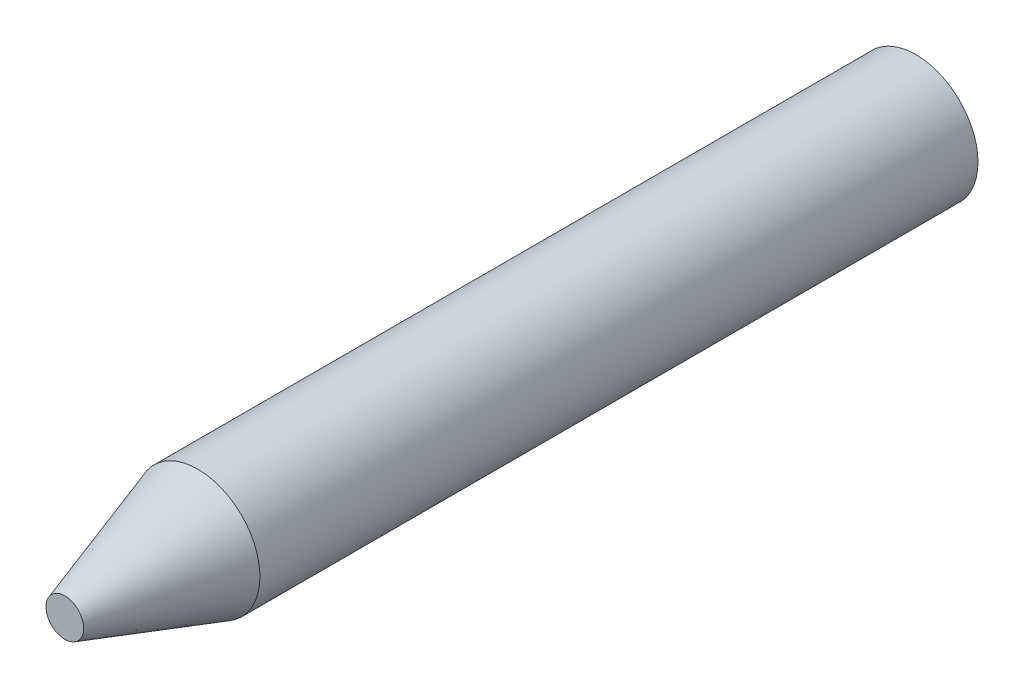
ISO-10303-21;
HEADER;
FILE_DESCRIPTION(('STEP AP214'),'2;1');
FILE_NAME('part.step','',(''),(''),'','','');
FILE_SCHEMA(('AUTOMOTIVE_DESIGN { 1 0 10303 214 1 1 1 1 }'));
ENDSEC;
DATA;
#1=APPLICATION_CONTEXT('core data for automotive mechanical design processes');
#2=APPLICATION_PROTOCOL_DEFINITION('international standard','automotive_design',2000,#1);
#3=PRODUCT_CONTEXT('',#1,'mechanical');
#4=PRODUCT('Part','Part','',(#3));
#5=PRODUCT_RELATED_PRODUCT_CATEGORY('part','',(#4));
#6=PRODUCT_DEFINITION_FORMATION('','',#4);
#7=PRODUCT_DEFINITION_CONTEXT('part definition',#1,'design');
#8=PRODUCT_DEFINITION('design','',#6,#7);
#9=PRODUCT_DEFINITION_SHAPE('','',#8);
#10=(LENGTH_UNIT() NAMED_UNIT(*) SI_UNIT(.MILLI.,.METRE.));
#11=(NAMED_UNIT(*) PLANE_ANGLE_UNIT() SI_UNIT($,.RADIAN.));
#12=(NAMED_UNIT(*) SI_UNIT($,.STERADIAN.) SOLID_ANGLE_UNIT());
#13=UNCERTAINTY_MEASURE_WITH_UNIT(LENGTH_MEASURE(1.E-05),#10,'distance_accuracy_value','');
#14=(GEOMETRIC_REPRESENTATION_CONTEXT(3) GLOBAL_UNCERTAINTY_ASSIGNED_CONTEXT((#13)) GLOBAL_UNIT_ASSIGNED_CONTEXT((#10,
#11,#12)) REPRESENTATION_CONTEXT('',''));
#15=CARTESIAN_POINT('',(0.,0.,0.));
#16=DIRECTION('',(0.,0.,1.));
#17=DIRECTION('',(1.,0.,0.));
#18=AXIS2_PLACEMENT_3D('',#15,#16,#17);
#19=CARTESIAN_POINT('',(0.,0.,96.));
#20=DIRECTION('',(0.,0.,-1.));
#21=DIRECTION('',(-1.,0.,0.));
#22=AXIS2_PLACEMENT_3D('',#19,#20,#21);
#23=CYLINDRICAL_SURFACE('',#22,7.);
#24=CARTESIAN_POINT('',(0.,0.,80.9999999999999));
#25=DIRECTION('',(0.,0.,1.));
#26=DIRECTION('',(1.,0.,0.));
#27=AXIS2_PLACEMENT_3D('',#24,#25,#26);
#28=CIRCLE('',#27,7.);
#29=CARTESIAN_POINT('',(-7.,0.,80.9999999999999));
#30=VERTEX_POINT('',#29);
#31=EDGE_CURVE('E10',#30,#30,#28,.F.);
#32=ORIENTED_EDGE('',*,*,#31,.T.);
#33=EDGE_LOOP('',(#32));
#34=FACE_BOUND('',#33,.T.);
#35=CARTESIAN_POINT('',(0.,0.,0.));
#36=DIRECTION('',(0.,0.,1.));
#37=DIRECTION('',(1.,0.,0.));
#38=AXIS2_PLACEMENT_3D('',#35,#36,#37);
#39=CIRCLE('',#38,7.);
#40=CARTESIAN_POINT('',(7.,0.,0.));
#41=VERTEX_POINT('',#40);
#42=EDGE_CURVE('E57',#41,#41,#39,.T.);
#43=ORIENTED_EDGE('',*,*,#42,.T.);
#44=EDGE_LOOP('',(#43));
#45=FACE_BOUND('',#44,.T.);
#46=ADVANCED_FACE('F43',(#34,#45),#23,.T.);
#47=CARTESIAN_POINT('',(0.,0.,96.));
#48=DIRECTION('',(0.,0.,1.));
#49=DIRECTION('',(1.,0.,0.));
#50=AXIS2_PLACEMENT_3D('',#47,#48,#49);
#51=PLANE('',#50);
#52=CARTESIAN_POINT('',(0.,0.,96.));
#53=DIRECTION('',(0.,0.,1.));
#54=DIRECTION('',(1.,0.,0.));
#55=AXIS2_PLACEMENT_3D('',#52,#53,#54);
#56=CIRCLE('',#55,2.1262045565064);
#57=CARTESIAN_POINT('',(-2.12620455650641,0.,96.));
#58=VERTEX_POINT('',#57);
#59=EDGE_CURVE('E52',#58,#58,#56,.T.);
#60=ORIENTED_EDGE('',*,*,#59,.T.);
#61=EDGE_LOOP('',(#60));
#62=FACE_BOUND('',#61,.T.);
#63=ADVANCED_FACE('F68',(#62),#51,.T.);
#64=CARTESIAN_POINT('',(0.,0.,0.));
#65=DIRECTION('',(0.,0.,1.));
#66=DIRECTION('',(1.,0.,0.));
#67=AXIS2_PLACEMENT_3D('',#64,#65,#66);
#68=PLANE('',#67);
#69=ORIENTED_EDGE('',*,*,#42,.F.);
#70=EDGE_LOOP('',(#69));
#71=FACE_BOUND('',#70,.T.);
#72=ADVANCED_FACE('F66',(#71),#68,.F.);
#73=CARTESIAN_POINT('',(0.,0.,96.));
#74=DIRECTION('',(0.,0.,-1.));
#75=DIRECTION('',(-1.,0.,0.));
#76=AXIS2_PLACEMENT_3D('',#73,#74,#75);
#77=CONICAL_SURFACE('',#76,2.1262045565064,0.314159265358977);
#78=CARTESIAN_POINT('',(-7.,0.,80.9999999999999));
#79=CARTESIAN_POINT('',(-6.94923129746361,0.,81.1562499999999));
#80=CARTESIAN_POINT('',(-6.89846259492722,0.,81.3124999999999));
#81=CARTESIAN_POINT('',(-6.79692518985444,0.,81.6249999999999));
#82=CARTESIAN_POINT('',(-6.74615648731804,0.,81.7812499999999));
#83=CARTESIAN_POINT('',(-6.64461908224526,0.,82.0937499999999));
#84=CARTESIAN_POINT('',(-6.59385037970887,0.,82.2499999999999));
#85=CARTESIAN_POINT('',(-6.49231297463609,0.,82.5624999999999));
#86=CARTESIAN_POINT('',(-6.44154427209969,0.,82.7187499999999));
#87=CARTESIAN_POINT('',(-6.34000686702691,0.,83.0312499999999));
#88=CARTESIAN_POINT('',(-6.28923816449052,0.,83.1874999999999));
#89=CARTESIAN_POINT('',(-6.18770075941774,0.,83.4999999999999));
#90=CARTESIAN_POINT('',(-6.13693205688134,0.,83.6562499999999));
#91=CARTESIAN_POINT('',(-6.03539465180856,0.,83.9687499999999));
#92=CARTESIAN_POINT('',(-5.98462594927217,0.,84.1249999999999));
#93=CARTESIAN_POINT('',(-5.88308854419939,0.,84.4374999999999));
#94=CARTESIAN_POINT('',(-5.83231984166299,0.,84.5937499999999));
#95=CARTESIAN_POINT('',(-5.73078243659021,0.,84.9062499999999));
#96=CARTESIAN_POINT('',(-5.68001373405382,0.,85.0624999999999));
#97=CARTESIAN_POINT('',(-5.57847632898104,0.,85.3749999999999));
#98=CARTESIAN_POINT('',(-5.52770762644464,0.,85.5312499999999));
#99=CARTESIAN_POINT('',(-5.42617022137186,0.,85.8437499999999));
#100=CARTESIAN_POINT('',(-5.37540151883547,0.,85.9999999999999));
#101=CARTESIAN_POINT('',(-5.27386411376269,0.,86.3124999999999));
#102=CARTESIAN_POINT('',(-5.22309541122629,0.,86.4687499999999));
#103=CARTESIAN_POINT('',(-5.12155800615351,0.,86.7812499999999));
#104=CARTESIAN_POINT('',(-5.07078930361712,0.,86.9374999999999));
#105=CARTESIAN_POINT('',(-4.96925189854434,0.,87.2499999999999));
#106=CARTESIAN_POINT('',(-4.91848319600794,0.,87.4062499999999));
#107=CARTESIAN_POINT('',(-4.81694579093516,0.,87.7187499999999));
#108=CARTESIAN_POINT('',(-4.76617708839877,0.,87.8749999999999));
#109=CARTESIAN_POINT('',(-4.66463968332599,0.,88.1874999999999));
#110=CARTESIAN_POINT('',(-4.6138709807896,0.,88.3437499999999));
#111=CARTESIAN_POINT('',(-4.51233357571681,0.,88.6562499999999));
#112=CARTESIAN_POINT('',(-4.46156487318042,0.,88.8124999999999));
#113=CARTESIAN_POINT('',(-4.36002746810764,0.,89.1249999999999));
#114=CARTESIAN_POINT('',(-4.30925876557125,0.,89.2812499999999));
#115=CARTESIAN_POINT('',(-4.20772136049846,0.,89.5937499999999));
#116=CARTESIAN_POINT('',(-4.15695265796207,0.,89.7499999999999));
#117=CARTESIAN_POINT('',(-4.05541525288929,0.,90.0624999999999));
#118=CARTESIAN_POINT('',(-4.0046465503529,0.,90.2187499999999));
#119=CARTESIAN_POINT('',(-3.90310914528011,0.,90.5312499999999));
#120=CARTESIAN_POINT('',(-3.85234044274372,0.,90.6874999999999));
#121=CARTESIAN_POINT('',(-3.75080303767094,0.,90.9999999999999));
#122=CARTESIAN_POINT('',(-3.70003433513455,0.,91.15625));
#123=CARTESIAN_POINT('',(-3.59849693006176,0.,91.4687499999999));
#124=CARTESIAN_POINT('',(-3.54772822752537,0.,91.625));
#125=CARTESIAN_POINT('',(-3.44619082245259,0.,91.9374999999999));
#126=CARTESIAN_POINT('',(-3.3954221199162,0.,92.09375));
#127=CARTESIAN_POINT('',(-3.29388471484341,0.,92.40625));
#128=CARTESIAN_POINT('',(-3.24311601230702,0.,92.5625));
#129=CARTESIAN_POINT('',(-3.14157860723424,0.,92.875));
#130=CARTESIAN_POINT('',(-3.09080990469785,0.,93.03125));
#131=CARTESIAN_POINT('',(-2.98927249962506,0.,93.34375));
#132=CARTESIAN_POINT('',(-2.93850379708867,0.,93.5));
#133=CARTESIAN_POINT('',(-2.83696639201589,0.,93.8125));
#134=CARTESIAN_POINT('',(-2.7861976894795,0.,93.96875));
#135=CARTESIAN_POINT('',(-2.68466028440671,0.,94.28125));
#136=CARTESIAN_POINT('',(-2.63389158187032,0.,94.4375));
#137=CARTESIAN_POINT('',(-2.53235417679754,0.,94.75));
#138=CARTESIAN_POINT('',(-2.48158547426115,0.,94.90625));
#139=CARTESIAN_POINT('',(-2.38004806918836,0.,95.21875));
#140=CARTESIAN_POINT('',(-2.32927936665197,0.,95.375));
#141=CARTESIAN_POINT('',(-2.22774196157919,0.,95.6875));
#142=CARTESIAN_POINT('',(-2.1769732590428,0.,95.84375));
#143=CARTESIAN_POINT('',(-2.12620455650641,0.,96.));
#144=B_SPLINE_CURVE_WITH_KNOTS('',3,(#78,#79,#80,#81,#82,#83,#84,#85,#86,#87,#88,#89,#90,#91,
#92,#93,#94,#95,#96,#97,#98,#99,#100,#101,#102,#103,#104,#105,#106,#107,#108,#109,#110,#111,
#112,#113,#114,#115,#116,#117,#118,#119,#120,#121,#122,#123,#124,#125,#126,#127,#128,#129,#130,
#131,#132,#133,#134,#135,#136,#137,#138,#139,#140,#141,#142,#143),.UNSPECIFIED.,.F.,.F.,(4,2,2,
2,2,2,2,2,2,2,2,2,2,2,2,2,2,2,2,2,2,2,2,2,2,2,2,2,2,2,2,2,4),(0.,0.492872917611691,
0.985745835223383,1.47861875283507,1.97149167044677,2.46436458805846,2.95723750567015,
3.45011042328184,3.94298334089353,4.43585625850522,4.92872917611692,5.42160209372861,
5.9144750113403,6.40734792895199,6.90022084656368,7.39309376417537,7.88596668178706,
8.37883959939876,8.87171251701045,9.36458543462214,9.85745835223383,10.3503312698455,
10.8432041874572,11.3360771050689,11.8289500226806,12.3218229402923,12.814695857904,
13.3075687755157,13.8004416931274,14.2933146107391,14.7861875283508,15.2790604459625,
15.7719333635741),.UNSPECIFIED.);
#145=EDGE_CURVE('BSEAM46',#30,#58,#144,.T.);
#146=ORIENTED_EDGE('',*,*,#31,.F.);
#147=ORIENTED_EDGE('',*,*,#59,.F.);
#148=ORIENTED_EDGE('',*,*,#145,.T.);
#149=ORIENTED_EDGE('',*,*,#145,.F.);
#150=EDGE_LOOP('',(#146,#148,#147,#149));
#151=FACE_BOUND('',#150,.T.);
#152=ADVANCED_FACE('F46',(#151),#77,.T.);
#153=CLOSED_SHELL('',(#46,#63,#72,#152));
#154=MANIFOLD_SOLID_BREP('B2',#153);
#155=ADVANCED_BREP_SHAPE_REPRESENTATION('',(#18,#154),#14);
#156=SHAPE_DEFINITION_REPRESENTATION(#9,#155);
ENDSEC;
END-ISO-10303-21;
